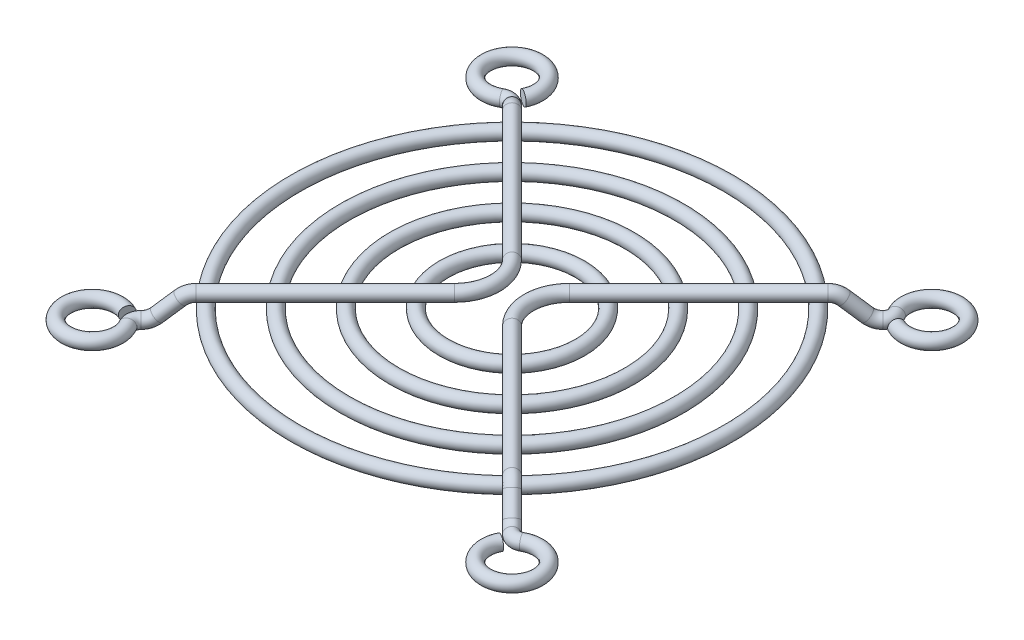
ISO-10303-21;
HEADER;
FILE_DESCRIPTION(('STEP AP214'),'2;1');
FILE_NAME('part.step','',(''),(''),'','','');
FILE_SCHEMA(('AUTOMOTIVE_DESIGN { 1 0 10303 214 1 1 1 1 }'));
ENDSEC;
DATA;
#1=APPLICATION_CONTEXT('core data for automotive mechanical design processes');
#2=APPLICATION_PROTOCOL_DEFINITION('international standard','automotive_design',2000,#1);
#3=PRODUCT_CONTEXT('',#1,'mechanical');
#4=PRODUCT('Part','Part','',(#3));
#5=PRODUCT_RELATED_PRODUCT_CATEGORY('part','',(#4));
#6=PRODUCT_DEFINITION_FORMATION('','',#4);
#7=PRODUCT_DEFINITION_CONTEXT('part definition',#1,'design');
#8=PRODUCT_DEFINITION('design','',#6,#7);
#9=PRODUCT_DEFINITION_SHAPE('','',#8);
#10=(LENGTH_UNIT() NAMED_UNIT(*) SI_UNIT(.MILLI.,.METRE.));
#11=(NAMED_UNIT(*) PLANE_ANGLE_UNIT() SI_UNIT($,.RADIAN.));
#12=(NAMED_UNIT(*) SI_UNIT($,.STERADIAN.) SOLID_ANGLE_UNIT());
#13=UNCERTAINTY_MEASURE_WITH_UNIT(LENGTH_MEASURE(1.E-05),#10,'distance_accuracy_value','');
#14=(GEOMETRIC_REPRESENTATION_CONTEXT(3) GLOBAL_UNCERTAINTY_ASSIGNED_CONTEXT((#13)) GLOBAL_UNIT_ASSIGNED_CONTEXT((#10,
#11,#12)) REPRESENTATION_CONTEXT('',''));
#15=CARTESIAN_POINT('',(0.,0.,0.));
#16=DIRECTION('',(0.,0.,1.));
#17=DIRECTION('',(1.,0.,0.));
#18=AXIS2_PLACEMENT_3D('',#15,#16,#17);
#19=CARTESIAN_POINT('',(3.41421356237311,3.6,3.41421356237314));
#20=DIRECTION('',(0.707106781186544,0.,0.707106781186551));
#21=DIRECTION('',(0.707106781186551,0.,-0.707106781186544));
#22=AXIS2_PLACEMENT_3D('',#19,#20,#21);
#23=CYLINDRICAL_SURFACE('',#22,0.799999999999999);
#24=CARTESIAN_POINT('',(3.41421356237311,3.6,3.41421356237314));
#25=DIRECTION('',(-0.707106781186545,0.,-0.707106781186551));
#26=DIRECTION('',(-0.707106781186551,0.,0.707106781186545));
#27=AXIS2_PLACEMENT_3D('',#24,#25,#26);
#28=CIRCLE('',#27,0.799999999999999);
#29=CARTESIAN_POINT('',(2.84852813742387,3.6,3.97989898732237));
#30=VERTEX_POINT('',#29);
#31=EDGE_CURVE('E11',#30,#30,#28,.T.);
#32=ORIENTED_EDGE('',*,*,#31,.F.);
#33=EDGE_LOOP('',(#32));
#34=FACE_BOUND('',#33,.T.);
#35=CARTESIAN_POINT('',(18.8161114473739,3.6,18.8161114473741));
#36=DIRECTION('',(0.707106781186543,0.,0.707106781186552));
#37=DIRECTION('',(0.707106781186552,0.,-0.707106781186543));
#38=AXIS2_PLACEMENT_3D('',#35,#36,#37);
#39=CIRCLE('',#38,0.799999999999998);
#40=CARTESIAN_POINT('',(18.8161114473739,4.4,18.8161114473741));
#41=VERTEX_POINT('',#40);
#42=EDGE_CURVE('E63',#41,#41,#39,.T.);
#43=ORIENTED_EDGE('',*,*,#42,.F.);
#44=EDGE_LOOP('',(#43));
#45=FACE_BOUND('',#44,.T.);
#46=ADVANCED_FACE('F44',(#34,#45),#23,.T.);
#47=CARTESIAN_POINT('',(22.1008621971351,2.8,22.1008621971353));
#48=DIRECTION('',(-0.707106781186546,0.,0.707106781186549));
#49=DIRECTION('',(0.707106781186549,0.,0.707106781186546));
#50=AXIS2_PLACEMENT_3D('',#47,#48,#49);
#51=TOROIDAL_SURFACE('',#50,2.,0.799999999999998);
#52=CARTESIAN_POINT('',(21.1546131813162,1.3136536069531,21.1546131813164));
#53=DIRECTION('',(0.525502806857811,-0.669099095776639,0.52550280685782));
#54=DIRECTION('',(0.70710678118655,0.,-0.707106781186545));
#55=AXIS2_PLACEMENT_3D('',#52,#53,#54);
#56=CIRCLE('',#55,0.799999999999998);
#57=CARTESIAN_POINT('',(20.7761135749886,0.719115049734336,20.7761135749888));
#58=VERTEX_POINT('',#57);
#59=EDGE_CURVE('E54',#58,#58,#56,.T.);
#60=CARTESIAN_POINT('',(22.1008621971351,0.800000000000002,22.1008621971353));
#61=DIRECTION('',(0.707106781186543,0.,0.707106781186551));
#62=DIRECTION('',(0.707106781186552,0.,-0.707106781186544));
#63=AXIS2_PLACEMENT_3D('',#60,#61,#62);
#64=CIRCLE('',#63,0.799999999999998);
#65=CARTESIAN_POINT('',(22.1008621971351,0.,22.1008621971353));
#66=VERTEX_POINT('',#65);
#67=EDGE_CURVE('E50',#66,#66,#64,.T.);
#68=CARTESIAN_POINT('',(22.1008621971351,2.8,22.1008621971353));
#69=DIRECTION('',(-0.707106781186546,0.,0.707106781186549));
#70=DIRECTION('',(0.707106781186549,0.,0.707106781186546));
#71=AXIS2_PLACEMENT_3D('',#68,#69,#70);
#72=CIRCLE('',#71,2.79999999999999);
#73=EDGE_CURVE('',#58,#66,#72,.T.);
#74=ORIENTED_EDGE('',*,*,#59,.T.);
#75=ORIENTED_EDGE('',*,*,#67,.F.);
#76=ORIENTED_EDGE('',*,*,#73,.T.);
#77=ORIENTED_EDGE('',*,*,#73,.F.);
#78=EDGE_LOOP('',(#74,#76,#75,#77));
#79=FACE_BOUND('',#78,.T.);
#80=ADVANCED_FACE('F121',(#79),#51,.T.);
#81=CARTESIAN_POINT('',(19.7623604631928,3.0863463930469,19.762360463193));
#82=DIRECTION('',(0.525502806857816,-0.669099095776639,0.525502806857815));
#83=DIRECTION('',(-0.786442750779605,-0.617663176615062,0.));
#84=AXIS2_PLACEMENT_3D('',#81,#82,#83);
#85=CYLINDRICAL_SURFACE('',#84,0.799999999999998);
#86=CARTESIAN_POINT('',(19.7623604631928,3.0863463930469,19.762360463193));
#87=DIRECTION('',(0.525502806857811,-0.669099095776639,0.52550280685782));
#88=DIRECTION('',(0.70710678118655,0.,-0.707106781186545));
#89=AXIS2_PLACEMENT_3D('',#86,#87,#88);
#90=CIRCLE('',#89,0.799999999999998);
#91=CARTESIAN_POINT('',(20.1408600695204,3.68088495026566,20.1408600695206));
#92=VERTEX_POINT('',#91);
#93=EDGE_CURVE('E58',#92,#92,#90,.T.);
#94=ORIENTED_EDGE('',*,*,#93,.T.);
#95=EDGE_LOOP('',(#94));
#96=FACE_BOUND('',#95,.T.);
#97=ORIENTED_EDGE('',*,*,#59,.F.);
#98=EDGE_LOOP('',(#97));
#99=FACE_BOUND('',#98,.T.);
#100=ADVANCED_FACE('F126',(#96,#99),#85,.T.);
#101=CARTESIAN_POINT('',(18.8161114473739,1.6,18.8161114473741));
#102=DIRECTION('',(-0.707106781186546,0.,0.707106781186549));
#103=DIRECTION('',(0.707106781186549,0.,0.707106781186546));
#104=AXIS2_PLACEMENT_3D('',#101,#102,#103);
#105=TOROIDAL_SURFACE('',#104,2.,0.799999999999998);
#106=CARTESIAN_POINT('',(18.8161114473739,1.6,18.8161114473741));
#107=DIRECTION('',(-0.707106781186546,0.,0.707106781186549));
#108=DIRECTION('',(0.707106781186549,0.,0.707106781186546));
#109=AXIS2_PLACEMENT_3D('',#106,#107,#108);
#110=CIRCLE('',#109,2.8);
#111=EDGE_CURVE('',#92,#41,#110,.T.);
#112=ORIENTED_EDGE('',*,*,#93,.F.);
#113=ORIENTED_EDGE('',*,*,#42,.T.);
#114=ORIENTED_EDGE('',*,*,#111,.T.);
#115=ORIENTED_EDGE('',*,*,#111,.F.);
#116=EDGE_LOOP('',(#112,#114,#113,#115));
#117=FACE_BOUND('',#116,.T.);
#118=ADVANCED_FACE('F131',(#117),#105,.T.);
#119=CARTESIAN_POINT('',(24.9999999999999,0.800000000000002,25.0000000000001));
#120=DIRECTION('',(0.,-1.,0.));
#121=DIRECTION('',(0.,0.,1.));
#122=AXIS2_PLACEMENT_3D('',#119,#120,#121);
#123=TOROIDAL_SURFACE('',#122,3.09999999999999,0.800000000000002);
#124=CARTESIAN_POINT('',(23.488311687548,0.800000000000002,22.2935635152482));
#125=DIRECTION('',(0.873044027339341,0.,-0.487641391113495));
#126=DIRECTION('',(-0.487641391113495,0.,-0.873044027339341));
#127=AXIS2_PLACEMENT_3D('',#124,#125,#126);
#128=CIRCLE('',#127,0.800000000000002);
#129=CARTESIAN_POINT('',(23.0981985746572,0.800000000000002,21.5951282933767));
#130=VERTEX_POINT('',#129);
#131=EDGE_CURVE('E69',#130,#130,#128,.T.);
#132=CARTESIAN_POINT('',(22.2417768209678,0.800000000000002,23.5850071043818));
#133=DIRECTION('',(0.45644932116719,0.,-0.88974941259099));
#134=DIRECTION('',(-0.88974941259099,0.,-0.45644932116719));
#135=AXIS2_PLACEMENT_3D('',#132,#133,#134);
#136=CIRCLE('',#135,0.800000000000002);
#137=CARTESIAN_POINT('',(21.529977290895,0.800000000000002,23.2198476474481));
#138=VERTEX_POINT('',#137);
#139=EDGE_CURVE('E66',#138,#138,#136,.T.);
#140=CARTESIAN_POINT('',(24.9999999999999,0.800000000000002,25.0000000000001));
#141=DIRECTION('',(0.,-1.,0.));
#142=DIRECTION('',(0.,0.,1.));
#143=AXIS2_PLACEMENT_3D('',#140,#141,#142);
#144=CIRCLE('',#143,3.89999999999999);
#145=EDGE_CURVE('',#130,#138,#144,.T.);
#146=ORIENTED_EDGE('',*,*,#131,.T.);
#147=ORIENTED_EDGE('',*,*,#139,.F.);
#148=ORIENTED_EDGE('',*,*,#145,.T.);
#149=ORIENTED_EDGE('',*,*,#145,.F.);
#150=EDGE_LOOP('',(#146,#148,#147,#149));
#151=FACE_BOUND('',#150,.T.);
#152=ADVANCED_FACE('F133',(#151),#123,.T.);
#153=CARTESIAN_POINT('',(22.9220184591582,0.800000000000002,21.2797059351122));
#154=DIRECTION('',(0.,-1.,0.));
#155=DIRECTION('',(0.,0.,1.));
#156=AXIS2_PLACEMENT_3D('',#153,#154,#155);
#157=TOROIDAL_SURFACE('',#156,1.16129032258065,0.800000000000002);
#158=ORIENTED_EDGE('',*,*,#131,.F.);
#159=EDGE_LOOP('',(#158));
#160=FACE_BOUND('',#159,.T.);
#161=ORIENTED_EDGE('',*,*,#67,.T.);
#162=EDGE_LOOP('',(#161));
#163=FACE_BOUND('',#162,.T.);
#164=ADVANCED_FACE('F140',(#160,#163),#157,.T.);
#165=CARTESIAN_POINT('',(22.2417768209678,0.800000000000002,23.5850071043818));
#166=DIRECTION('',(0.45644932116719,0.,-0.88974941259099));
#167=DIRECTION('',(-0.88974941259099,0.,-0.45644932116719));
#168=AXIS2_PLACEMENT_3D('',#165,#166,#167);
#169=PLANE('',#168);
#170=ORIENTED_EDGE('',*,*,#139,.T.);
#171=EDGE_LOOP('',(#170));
#172=FACE_BOUND('',#171,.T.);
#173=ADVANCED_FACE('F143',(#172),#169,.T.);
#174=CARTESIAN_POINT('',(6.82842712474629,3.6,0.));
#175=DIRECTION('',(0.,-1.,0.));
#176=DIRECTION('',(0.,0.,-1.));
#177=AXIS2_PLACEMENT_3D('',#174,#175,#176);
#178=TOROIDAL_SURFACE('',#177,4.82842712474628,0.8);
#179=CARTESIAN_POINT('',(3.41421356237311,3.6,-3.41421356237314));
#180=DIRECTION('',(-0.707106781186543,0.,0.707106781186552));
#181=DIRECTION('',(0.707106781186552,0.,0.707106781186543));
#182=AXIS2_PLACEMENT_3D('',#179,#180,#181);
#183=CIRCLE('',#182,0.799999999999999);
#184=CARTESIAN_POINT('',(2.84852813742386,3.6,-3.97989898732238));
#185=VERTEX_POINT('',#184);
#186=EDGE_CURVE('E72',#185,#185,#183,.T.);
#187=CARTESIAN_POINT('',(6.82842712474629,3.6,0.));
#188=DIRECTION('',(0.,-1.,0.));
#189=DIRECTION('',(0.,0.,-1.));
#190=AXIS2_PLACEMENT_3D('',#187,#188,#189);
#191=CIRCLE('',#190,5.62842712474628);
#192=EDGE_CURVE('',#30,#185,#191,.T.);
#193=ORIENTED_EDGE('',*,*,#31,.T.);
#194=ORIENTED_EDGE('',*,*,#186,.T.);
#195=ORIENTED_EDGE('',*,*,#192,.T.);
#196=ORIENTED_EDGE('',*,*,#192,.F.);
#197=EDGE_LOOP('',(#193,#195,#194,#196));
#198=FACE_BOUND('',#197,.T.);
#199=ADVANCED_FACE('F117',(#198),#178,.T.);
#200=CARTESIAN_POINT('',(3.41421356237311,3.6,-3.41421356237314));
#201=DIRECTION('',(0.707106781186544,0.,-0.707106781186551));
#202=DIRECTION('',(-0.707106781186551,0.,-0.707106781186544));
#203=AXIS2_PLACEMENT_3D('',#200,#201,#202);
#204=CYLINDRICAL_SURFACE('',#203,0.799999999999999);
#205=ORIENTED_EDGE('',*,*,#186,.F.);
#206=EDGE_LOOP('',(#205));
#207=FACE_BOUND('',#206,.T.);
#208=CARTESIAN_POINT('',(18.8161114473739,3.6,-18.8161114473741));
#209=DIRECTION('',(0.707106781186544,0.,-0.707106781186551));
#210=DIRECTION('',(-0.707106781186551,0.,-0.707106781186544));
#211=AXIS2_PLACEMENT_3D('',#208,#209,#210);
#212=CIRCLE('',#211,0.799999999999998);
#213=CARTESIAN_POINT('',(18.8161114473739,4.4,-18.8161114473741));
#214=VERTEX_POINT('',#213);
#215=EDGE_CURVE('E84',#214,#214,#212,.T.);
#216=ORIENTED_EDGE('',*,*,#215,.F.);
#217=EDGE_LOOP('',(#216));
#218=FACE_BOUND('',#217,.T.);
#219=ADVANCED_FACE('F107',(#207,#218),#204,.T.);
#220=CARTESIAN_POINT('',(22.100862197135,2.8,-22.1008621971353));
#221=DIRECTION('',(0.707106781186556,0.,0.707106781186539));
#222=DIRECTION('',(0.707106781186539,0.,-0.707106781186556));
#223=AXIS2_PLACEMENT_3D('',#220,#221,#222);
#224=TOROIDAL_SURFACE('',#223,2.,0.799999999999998);
#225=CARTESIAN_POINT('',(21.1546131813162,1.3136536069531,-21.1546131813164));
#226=DIRECTION('',(0.525502806857814,-0.669099095776639,-0.525502806857817));
#227=DIRECTION('',(-0.707106781186552,0.,-0.707106781186543));
#228=AXIS2_PLACEMENT_3D('',#225,#226,#227);
#229=CIRCLE('',#228,0.799999999999998);
#230=CARTESIAN_POINT('',(20.7761135749886,0.719115049734336,-20.7761135749888));
#231=VERTEX_POINT('',#230);
#232=EDGE_CURVE('E78',#231,#231,#229,.T.);
#233=CARTESIAN_POINT('',(22.100862197135,0.800000000000002,-22.1008621971353));
#234=DIRECTION('',(0.707106781186544,0.,-0.707106781186551));
#235=DIRECTION('',(-0.707106781186551,0.,-0.707106781186544));
#236=AXIS2_PLACEMENT_3D('',#233,#234,#235);
#237=CIRCLE('',#236,0.799999999999998);
#238=CARTESIAN_POINT('',(22.100862197135,0.,-22.1008621971353));
#239=VERTEX_POINT('',#238);
#240=EDGE_CURVE('E75',#239,#239,#237,.T.);
#241=CARTESIAN_POINT('',(22.100862197135,2.8,-22.1008621971353));
#242=DIRECTION('',(0.707106781186556,0.,0.707106781186539));
#243=DIRECTION('',(0.707106781186539,0.,-0.707106781186556));
#244=AXIS2_PLACEMENT_3D('',#241,#242,#243);
#245=CIRCLE('',#244,2.79999999999999);
#246=EDGE_CURVE('',#231,#239,#245,.T.);
#247=ORIENTED_EDGE('',*,*,#232,.T.);
#248=ORIENTED_EDGE('',*,*,#240,.F.);
#249=ORIENTED_EDGE('',*,*,#246,.T.);
#250=ORIENTED_EDGE('',*,*,#246,.F.);
#251=EDGE_LOOP('',(#247,#249,#248,#250));
#252=FACE_BOUND('',#251,.T.);
#253=ADVANCED_FACE('F104',(#252),#224,.T.);
#254=CARTESIAN_POINT('',(19.7623604631928,3.0863463930469,-19.762360463193));
#255=DIRECTION('',(0.525502806857809,-0.669099095776639,-0.525502806857822));
#256=DIRECTION('',(0.,-0.617663176615062,0.786442750779605));
#257=AXIS2_PLACEMENT_3D('',#254,#255,#256);
#258=CYLINDRICAL_SURFACE('',#257,0.799999999999998);
#259=CARTESIAN_POINT('',(19.7623604631928,3.0863463930469,-19.762360463193));
#260=DIRECTION('',(0.525502806857814,-0.669099095776639,-0.525502806857817));
#261=DIRECTION('',(-0.707106781186552,0.,-0.707106781186543));
#262=AXIS2_PLACEMENT_3D('',#259,#260,#261);
#263=CIRCLE('',#262,0.799999999999998);
#264=CARTESIAN_POINT('',(20.1408600695204,3.68088495026566,-20.1408600695206));
#265=VERTEX_POINT('',#264);
#266=EDGE_CURVE('E81',#265,#265,#263,.T.);
#267=ORIENTED_EDGE('',*,*,#266,.T.);
#268=EDGE_LOOP('',(#267));
#269=FACE_BOUND('',#268,.T.);
#270=ORIENTED_EDGE('',*,*,#232,.F.);
#271=EDGE_LOOP('',(#270));
#272=FACE_BOUND('',#271,.T.);
#273=ADVANCED_FACE('F106',(#269,#272),#258,.T.);
#274=CARTESIAN_POINT('',(18.8161114473739,1.6,-18.8161114473741));
#275=DIRECTION('',(0.707106781186556,0.,0.707106781186539));
#276=DIRECTION('',(0.707106781186539,0.,-0.707106781186556));
#277=AXIS2_PLACEMENT_3D('',#274,#275,#276);
#278=TOROIDAL_SURFACE('',#277,2.,0.799999999999998);
#279=CARTESIAN_POINT('',(18.8161114473739,1.6,-18.8161114473741));
#280=DIRECTION('',(0.707106781186556,0.,0.707106781186539));
#281=DIRECTION('',(0.707106781186539,0.,-0.707106781186556));
#282=AXIS2_PLACEMENT_3D('',#279,#280,#281);
#283=CIRCLE('',#282,2.8);
#284=EDGE_CURVE('',#265,#214,#283,.T.);
#285=ORIENTED_EDGE('',*,*,#266,.F.);
#286=ORIENTED_EDGE('',*,*,#215,.T.);
#287=ORIENTED_EDGE('',*,*,#284,.T.);
#288=ORIENTED_EDGE('',*,*,#284,.F.);
#289=EDGE_LOOP('',(#285,#287,#286,#288));
#290=FACE_BOUND('',#289,.T.);
#291=ADVANCED_FACE('F114',(#290),#278,.T.);
#292=CARTESIAN_POINT('',(24.9999999999999,0.800000000000002,-25.0000000000001));
#293=DIRECTION('',(0.,-1.,0.));
#294=DIRECTION('',(1.,0.,0.));
#295=AXIS2_PLACEMENT_3D('',#292,#293,#294);
#296=TOROIDAL_SURFACE('',#295,3.09999999999999,0.800000000000002);
#297=CARTESIAN_POINT('',(22.2935635152479,0.800000000000002,-23.4883116875483));
#298=DIRECTION('',(-0.487641391113505,0.,-0.873044027339335));
#299=DIRECTION('',(-0.873044027339335,0.,0.487641391113505));
#300=AXIS2_PLACEMENT_3D('',#297,#298,#299);
#301=CIRCLE('',#300,0.800000000000002);
#302=CARTESIAN_POINT('',(21.5951282933765,0.800000000000002,-23.0981985746575));
#303=VERTEX_POINT('',#302);
#304=EDGE_CURVE('E90',#303,#303,#301,.T.);
#305=CARTESIAN_POINT('',(23.5850071043816,0.800000000000002,-22.2417768209681));
#306=DIRECTION('',(-0.889749412590994,0.,-0.456449321167181));
#307=DIRECTION('',(-0.456449321167181,0.,0.889749412590994));
#308=AXIS2_PLACEMENT_3D('',#305,#306,#307);
#309=CIRCLE('',#308,0.800000000000002);
#310=CARTESIAN_POINT('',(23.2198476474479,0.800000000000002,-21.5299772908953));
#311=VERTEX_POINT('',#310);
#312=EDGE_CURVE('E87',#311,#311,#309,.T.);
#313=CARTESIAN_POINT('',(24.9999999999999,0.800000000000002,-25.0000000000001));
#314=DIRECTION('',(0.,-1.,0.));
#315=DIRECTION('',(1.,0.,0.));
#316=AXIS2_PLACEMENT_3D('',#313,#314,#315);
#317=CIRCLE('',#316,3.89999999999999);
#318=EDGE_CURVE('',#303,#311,#317,.T.);
#319=ORIENTED_EDGE('',*,*,#304,.T.);
#320=ORIENTED_EDGE('',*,*,#312,.F.);
#321=ORIENTED_EDGE('',*,*,#318,.T.);
#322=ORIENTED_EDGE('',*,*,#318,.F.);
#323=EDGE_LOOP('',(#319,#321,#320,#322));
#324=FACE_BOUND('',#323,.T.);
#325=ADVANCED_FACE('F94',(#324),#296,.T.);
#326=CARTESIAN_POINT('',(21.2797059351119,0.800000000000002,-22.9220184591584));
#327=DIRECTION('',(0.,-1.,0.));
#328=DIRECTION('',(1.,0.,0.));
#329=AXIS2_PLACEMENT_3D('',#326,#327,#328);
#330=TOROIDAL_SURFACE('',#329,1.16129032258065,0.800000000000002);
#331=ORIENTED_EDGE('',*,*,#304,.F.);
#332=EDGE_LOOP('',(#331));
#333=FACE_BOUND('',#332,.T.);
#334=ORIENTED_EDGE('',*,*,#240,.T.);
#335=EDGE_LOOP('',(#334));
#336=FACE_BOUND('',#335,.T.);
#337=ADVANCED_FACE('F97',(#333,#336),#330,.T.);
#338=CARTESIAN_POINT('',(23.5850071043816,0.800000000000002,-22.2417768209681));
#339=DIRECTION('',(-0.889749412590994,0.,-0.456449321167181));
#340=DIRECTION('',(-0.456449321167181,0.,0.889749412590994));
#341=AXIS2_PLACEMENT_3D('',#338,#339,#340);
#342=PLANE('',#341);
#343=ORIENTED_EDGE('',*,*,#312,.T.);
#344=EDGE_LOOP('',(#343));
#345=FACE_BOUND('',#344,.T.);
#346=ADVANCED_FACE('F100',(#345),#342,.T.);
#347=CLOSED_SHELL('',(#46,#80,#100,#118,#152,#164,#173,#199,#219,#253,#273,#291,#325,#337,#346));
#348=MANIFOLD_SOLID_BREP('B2',#347);
#349=CARTESIAN_POINT('',(-3.41421356237313,3.6,3.41421356237312));
#350=DIRECTION('',(-0.707106781186549,0.,0.707106781186546));
#351=DIRECTION('',(0.707106781186546,0.,0.707106781186549));
#352=AXIS2_PLACEMENT_3D('',#349,#350,#351);
#353=CYLINDRICAL_SURFACE('',#352,0.799999999999999);
#354=CARTESIAN_POINT('',(-3.41421356237313,3.6,3.41421356237312));
#355=DIRECTION('',(0.707106781186548,0.,-0.707106781186547));
#356=DIRECTION('',(-0.707106781186547,0.,-0.707106781186548));
#357=AXIS2_PLACEMENT_3D('',#354,#355,#356);
#358=CIRCLE('',#357,0.799999999999999);
#359=CARTESIAN_POINT('',(-2.84852813742389,3.6,3.97989898732236));
#360=VERTEX_POINT('',#359);
#361=EDGE_CURVE('E43',#360,#360,#358,.T.);
#362=ORIENTED_EDGE('',*,*,#361,.F.);
#363=EDGE_LOOP('',(#362));
#364=FACE_BOUND('',#363,.T.);
#365=CARTESIAN_POINT('',(-18.8161114473741,3.6,18.816111447374));
#366=DIRECTION('',(-0.707106781186549,0.,0.707106781186546));
#367=DIRECTION('',(0.707106781186546,0.,0.707106781186549));
#368=AXIS2_PLACEMENT_3D('',#365,#366,#367);
#369=CIRCLE('',#368,0.799999999999998);
#370=CARTESIAN_POINT('',(-18.8161114473741,4.4,18.816111447374));
#371=VERTEX_POINT('',#370);
#372=EDGE_CURVE('E290',#371,#371,#369,.T.);
#373=ORIENTED_EDGE('',*,*,#372,.F.);
#374=EDGE_LOOP('',(#373));
#375=FACE_BOUND('',#374,.T.);
#376=ADVANCED_FACE('F271',(#364,#375),#353,.T.);
#377=CARTESIAN_POINT('',(-22.1008621971352,2.8,22.1008621971351));
#378=DIRECTION('',(-0.707106781186551,0.,-0.707106781186544));
#379=DIRECTION('',(-0.707106781186544,0.,0.707106781186551));
#380=AXIS2_PLACEMENT_3D('',#377,#378,#379);
#381=TOROIDAL_SURFACE('',#380,2.,0.799999999999998);
#382=CARTESIAN_POINT('',(-21.1546131813163,1.3136536069531,21.1546131813163));
#383=DIRECTION('',(-0.525502806857818,-0.669099095776639,0.525502806857813));
#384=DIRECTION('',(0.707106781186547,0.,0.707106781186548));
#385=AXIS2_PLACEMENT_3D('',#382,#383,#384);
#386=CIRCLE('',#385,0.799999999999998);
#387=CARTESIAN_POINT('',(-20.7761135749887,0.719115049734336,20.7761135749887));
#388=VERTEX_POINT('',#387);
#389=EDGE_CURVE('E281',#388,#388,#386,.T.);
#390=CARTESIAN_POINT('',(-22.1008621971352,0.800000000000002,22.1008621971352));
#391=DIRECTION('',(-0.707106781186549,0.,0.707106781186546));
#392=DIRECTION('',(0.707106781186546,0.,0.707106781186549));
#393=AXIS2_PLACEMENT_3D('',#390,#391,#392);
#394=CIRCLE('',#393,0.799999999999998);
#395=CARTESIAN_POINT('',(-22.1008621971352,0.,22.1008621971352));
#396=VERTEX_POINT('',#395);
#397=EDGE_CURVE('E277',#396,#396,#394,.T.);
#398=CARTESIAN_POINT('',(-22.1008621971352,2.8,22.1008621971351));
#399=DIRECTION('',(-0.707106781186551,0.,-0.707106781186544));
#400=DIRECTION('',(-0.707106781186544,0.,0.707106781186551));
#401=AXIS2_PLACEMENT_3D('',#398,#399,#400);
#402=CIRCLE('',#401,2.79999999999999);
#403=EDGE_CURVE('',#388,#396,#402,.T.);
#404=ORIENTED_EDGE('',*,*,#389,.T.);
#405=ORIENTED_EDGE('',*,*,#397,.F.);
#406=ORIENTED_EDGE('',*,*,#403,.T.);
#407=ORIENTED_EDGE('',*,*,#403,.F.);
#408=EDGE_LOOP('',(#404,#406,#405,#407));
#409=FACE_BOUND('',#408,.T.);
#410=ADVANCED_FACE('F348',(#409),#381,.T.);
#411=CARTESIAN_POINT('',(-19.762360463193,3.0863463930469,19.7623604631929));
#412=DIRECTION('',(-0.525502806857813,-0.669099095776639,0.525502806857818));
#413=DIRECTION('',(0.,-0.617663176615062,-0.786442750779605));
#414=AXIS2_PLACEMENT_3D('',#411,#412,#413);
#415=CYLINDRICAL_SURFACE('',#414,0.799999999999998);
#416=CARTESIAN_POINT('',(-19.762360463193,3.0863463930469,19.7623604631929));
#417=DIRECTION('',(-0.525502806857818,-0.669099095776639,0.525502806857813));
#418=DIRECTION('',(0.707106781186547,0.,0.707106781186548));
#419=AXIS2_PLACEMENT_3D('',#416,#417,#418);
#420=CIRCLE('',#419,0.799999999999998);
#421=CARTESIAN_POINT('',(-20.1408600695205,3.68088495026566,20.1408600695205));
#422=VERTEX_POINT('',#421);
#423=EDGE_CURVE('E285',#422,#422,#420,.T.);
#424=ORIENTED_EDGE('',*,*,#423,.T.);
#425=EDGE_LOOP('',(#424));
#426=FACE_BOUND('',#425,.T.);
#427=ORIENTED_EDGE('',*,*,#389,.F.);
#428=EDGE_LOOP('',(#427));
#429=FACE_BOUND('',#428,.T.);
#430=ADVANCED_FACE('F353',(#426,#429),#415,.T.);
#431=CARTESIAN_POINT('',(-18.8161114473741,1.6,18.816111447374));
#432=DIRECTION('',(-0.707106781186551,0.,-0.707106781186544));
#433=DIRECTION('',(-0.707106781186544,0.,0.707106781186551));
#434=AXIS2_PLACEMENT_3D('',#431,#432,#433);
#435=TOROIDAL_SURFACE('',#434,2.,0.799999999999998);
#436=CARTESIAN_POINT('',(-18.8161114473741,1.6,18.816111447374));
#437=DIRECTION('',(-0.707106781186551,0.,-0.707106781186544));
#438=DIRECTION('',(-0.707106781186544,0.,0.707106781186551));
#439=AXIS2_PLACEMENT_3D('',#436,#437,#438);
#440=CIRCLE('',#439,2.8);
#441=EDGE_CURVE('',#422,#371,#440,.T.);
#442=ORIENTED_EDGE('',*,*,#423,.F.);
#443=ORIENTED_EDGE('',*,*,#372,.T.);
#444=ORIENTED_EDGE('',*,*,#441,.T.);
#445=ORIENTED_EDGE('',*,*,#441,.F.);
#446=EDGE_LOOP('',(#442,#444,#443,#445));
#447=FACE_BOUND('',#446,.T.);
#448=ADVANCED_FACE('F358',(#447),#435,.T.);
#449=CARTESIAN_POINT('',(-25.0000000000001,0.800000000000002,25.));
#450=DIRECTION('',(0.,-1.,0.));
#451=DIRECTION('',(-1.,0.,0.));
#452=AXIS2_PLACEMENT_3D('',#449,#450,#451);
#453=TOROIDAL_SURFACE('',#452,3.09999999999999,0.800000000000002);
#454=CARTESIAN_POINT('',(-22.2935635152481,0.800000000000002,23.4883116875481));
#455=DIRECTION('',(0.487641391113498,0.,0.873044027339339));
#456=DIRECTION('',(0.873044027339339,0.,-0.487641391113498));
#457=AXIS2_PLACEMENT_3D('',#454,#455,#456);
#458=CIRCLE('',#457,0.800000000000002);
#459=CARTESIAN_POINT('',(-21.5951282933766,0.800000000000002,23.0981985746573));
#460=VERTEX_POINT('',#459);
#461=EDGE_CURVE('E296',#460,#460,#458,.T.);
#462=CARTESIAN_POINT('',(-23.5850071043818,0.800000000000002,22.2417768209679));
#463=DIRECTION('',(0.889749412590991,0.,0.456449321167187));
#464=DIRECTION('',(0.456449321167187,0.,-0.889749412590991));
#465=AXIS2_PLACEMENT_3D('',#462,#463,#464);
#466=CIRCLE('',#465,0.800000000000002);
#467=CARTESIAN_POINT('',(-23.219847647448,0.800000000000002,21.5299772908951));
#468=VERTEX_POINT('',#467);
#469=EDGE_CURVE('E293',#468,#468,#466,.T.);
#470=CARTESIAN_POINT('',(-25.0000000000001,0.800000000000002,25.));
#471=DIRECTION('',(0.,-1.,0.));
#472=DIRECTION('',(-1.,0.,0.));
#473=AXIS2_PLACEMENT_3D('',#470,#471,#472);
#474=CIRCLE('',#473,3.89999999999999);
#475=EDGE_CURVE('',#460,#468,#474,.T.);
#476=ORIENTED_EDGE('',*,*,#461,.T.);
#477=ORIENTED_EDGE('',*,*,#469,.F.);
#478=ORIENTED_EDGE('',*,*,#475,.T.);
#479=ORIENTED_EDGE('',*,*,#475,.F.);
#480=EDGE_LOOP('',(#476,#478,#477,#479));
#481=FACE_BOUND('',#480,.T.);
#482=ADVANCED_FACE('F360',(#481),#453,.T.);
#483=CARTESIAN_POINT('',(-21.2797059351121,0.800000000000002,22.9220184591582));
#484=DIRECTION('',(0.,-1.,0.));
#485=DIRECTION('',(-1.,0.,0.));
#486=AXIS2_PLACEMENT_3D('',#483,#484,#485);
#487=TOROIDAL_SURFACE('',#486,1.16129032258065,0.800000000000002);
#488=ORIENTED_EDGE('',*,*,#461,.F.);
#489=EDGE_LOOP('',(#488));
#490=FACE_BOUND('',#489,.T.);
#491=ORIENTED_EDGE('',*,*,#397,.T.);
#492=EDGE_LOOP('',(#491));
#493=FACE_BOUND('',#492,.T.);
#494=ADVANCED_FACE('F367',(#490,#493),#487,.T.);
#495=CARTESIAN_POINT('',(-23.5850071043818,0.800000000000002,22.2417768209679));
#496=DIRECTION('',(0.889749412590991,0.,0.456449321167187));
#497=DIRECTION('',(0.456449321167187,0.,-0.889749412590991));
#498=AXIS2_PLACEMENT_3D('',#495,#496,#497);
#499=PLANE('',#498);
#500=ORIENTED_EDGE('',*,*,#469,.T.);
#501=EDGE_LOOP('',(#500));
#502=FACE_BOUND('',#501,.T.);
#503=ADVANCED_FACE('F370',(#502),#499,.T.);
#504=CARTESIAN_POINT('',(-6.82842712474626,3.6,0.));
#505=DIRECTION('',(0.,1.,0.));
#506=DIRECTION('',(0.,0.,1.));
#507=AXIS2_PLACEMENT_3D('',#504,#505,#506);
#508=TOROIDAL_SURFACE('',#507,4.82842712474625,0.799999999999999);
#509=CARTESIAN_POINT('',(-3.41421356237311,3.6,-3.41421356237314));
#510=DIRECTION('',(0.707106781186545,0.,0.707106781186551));
#511=DIRECTION('',(0.707106781186551,0.,-0.707106781186545));
#512=AXIS2_PLACEMENT_3D('',#509,#510,#511);
#513=CIRCLE('',#512,0.799999999999999);
#514=CARTESIAN_POINT('',(-2.84852813742387,3.6,-3.97989898732238));
#515=VERTEX_POINT('',#514);
#516=EDGE_CURVE('E299',#515,#515,#513,.T.);
#517=CARTESIAN_POINT('',(-6.82842712474626,3.6,0.));
#518=DIRECTION('',(0.,1.,0.));
#519=DIRECTION('',(0.,0.,1.));
#520=AXIS2_PLACEMENT_3D('',#517,#518,#519);
#521=CIRCLE('',#520,5.62842712474625);
#522=EDGE_CURVE('',#360,#515,#521,.T.);
#523=ORIENTED_EDGE('',*,*,#361,.T.);
#524=ORIENTED_EDGE('',*,*,#516,.T.);
#525=ORIENTED_EDGE('',*,*,#522,.T.);
#526=ORIENTED_EDGE('',*,*,#522,.F.);
#527=EDGE_LOOP('',(#523,#525,#524,#526));
#528=FACE_BOUND('',#527,.T.);
#529=ADVANCED_FACE('F344',(#528),#508,.T.);
#530=CARTESIAN_POINT('',(-3.41421356237311,3.6,-3.41421356237314));
#531=DIRECTION('',(-0.707106781186544,0.,-0.707106781186551));
#532=DIRECTION('',(-0.707106781186551,0.,0.707106781186544));
#533=AXIS2_PLACEMENT_3D('',#530,#531,#532);
#534=CYLINDRICAL_SURFACE('',#533,0.799999999999999);
#535=ORIENTED_EDGE('',*,*,#516,.F.);
#536=EDGE_LOOP('',(#535));
#537=FACE_BOUND('',#536,.T.);
#538=CARTESIAN_POINT('',(-18.8161114473739,3.6,-18.8161114473741));
#539=DIRECTION('',(-0.707106781186543,0.,-0.707106781186552));
#540=DIRECTION('',(-0.707106781186552,0.,0.707106781186543));
#541=AXIS2_PLACEMENT_3D('',#538,#539,#540);
#542=CIRCLE('',#541,0.799999999999998);
#543=CARTESIAN_POINT('',(-18.8161114473739,4.4,-18.8161114473741));
#544=VERTEX_POINT('',#543);
#545=EDGE_CURVE('E311',#544,#544,#542,.T.);
#546=ORIENTED_EDGE('',*,*,#545,.F.);
#547=EDGE_LOOP('',(#546));
#548=FACE_BOUND('',#547,.T.);
#549=ADVANCED_FACE('F334',(#537,#548),#534,.T.);
#550=CARTESIAN_POINT('',(-22.1008621971351,2.8,-22.1008621971353));
#551=DIRECTION('',(0.707106781186546,0.,-0.707106781186549));
#552=DIRECTION('',(-0.707106781186549,0.,-0.707106781186546));
#553=AXIS2_PLACEMENT_3D('',#550,#551,#552);
#554=TOROIDAL_SURFACE('',#553,2.,0.799999999999998);
#555=CARTESIAN_POINT('',(-21.1546131813162,1.3136536069531,-21.1546131813164));
#556=DIRECTION('',(-0.525502806857811,-0.669099095776639,-0.52550280685782));
#557=DIRECTION('',(-0.70710678118655,0.,0.707106781186545));
#558=AXIS2_PLACEMENT_3D('',#555,#556,#557);
#559=CIRCLE('',#558,0.799999999999998);
#560=CARTESIAN_POINT('',(-20.7761135749886,0.719115049734336,-20.7761135749888));
#561=VERTEX_POINT('',#560);
#562=EDGE_CURVE('E305',#561,#561,#559,.T.);
#563=CARTESIAN_POINT('',(-22.1008621971351,0.800000000000002,-22.1008621971353));
#564=DIRECTION('',(-0.707106781186543,0.,-0.707106781186551));
#565=DIRECTION('',(-0.707106781186552,0.,0.707106781186544));
#566=AXIS2_PLACEMENT_3D('',#563,#564,#565);
#567=CIRCLE('',#566,0.799999999999998);
#568=CARTESIAN_POINT('',(-22.1008621971351,0.,-22.1008621971353));
#569=VERTEX_POINT('',#568);
#570=EDGE_CURVE('E302',#569,#569,#567,.T.);
#571=CARTESIAN_POINT('',(-22.1008621971351,2.8,-22.1008621971353));
#572=DIRECTION('',(0.707106781186546,0.,-0.707106781186549));
#573=DIRECTION('',(-0.707106781186549,0.,-0.707106781186546));
#574=AXIS2_PLACEMENT_3D('',#571,#572,#573);
#575=CIRCLE('',#574,2.79999999999999);
#576=EDGE_CURVE('',#561,#569,#575,.T.);
#577=ORIENTED_EDGE('',*,*,#562,.T.);
#578=ORIENTED_EDGE('',*,*,#570,.F.);
#579=ORIENTED_EDGE('',*,*,#576,.T.);
#580=ORIENTED_EDGE('',*,*,#576,.F.);
#581=EDGE_LOOP('',(#577,#579,#578,#580));
#582=FACE_BOUND('',#581,.T.);
#583=ADVANCED_FACE('F331',(#582),#554,.T.);
#584=CARTESIAN_POINT('',(-19.7623604631928,3.0863463930469,-19.762360463193));
#585=DIRECTION('',(-0.525502806857816,-0.669099095776639,-0.525502806857815));
#586=DIRECTION('',(0.786442750779605,-0.617663176615062,0.));
#587=AXIS2_PLACEMENT_3D('',#584,#585,#586);
#588=CYLINDRICAL_SURFACE('',#587,0.799999999999998);
#589=CARTESIAN_POINT('',(-19.7623604631928,3.0863463930469,-19.762360463193));
#590=DIRECTION('',(-0.525502806857811,-0.669099095776639,-0.52550280685782));
#591=DIRECTION('',(-0.70710678118655,0.,0.707106781186545));
#592=AXIS2_PLACEMENT_3D('',#589,#590,#591);
#593=CIRCLE('',#592,0.799999999999998);
#594=CARTESIAN_POINT('',(-20.1408600695204,3.68088495026566,-20.1408600695206));
#595=VERTEX_POINT('',#594);
#596=EDGE_CURVE('E308',#595,#595,#593,.T.);
#597=ORIENTED_EDGE('',*,*,#596,.T.);
#598=EDGE_LOOP('',(#597));
#599=FACE_BOUND('',#598,.T.);
#600=ORIENTED_EDGE('',*,*,#562,.F.);
#601=EDGE_LOOP('',(#600));
#602=FACE_BOUND('',#601,.T.);
#603=ADVANCED_FACE('F333',(#599,#602),#588,.T.);
#604=CARTESIAN_POINT('',(-18.8161114473739,1.6,-18.8161114473741));
#605=DIRECTION('',(0.707106781186546,0.,-0.707106781186549));
#606=DIRECTION('',(-0.707106781186549,0.,-0.707106781186546));
#607=AXIS2_PLACEMENT_3D('',#604,#605,#606);
#608=TOROIDAL_SURFACE('',#607,2.,0.799999999999998);
#609=CARTESIAN_POINT('',(-18.8161114473739,1.6,-18.8161114473741));
#610=DIRECTION('',(0.707106781186546,0.,-0.707106781186549));
#611=DIRECTION('',(-0.707106781186549,0.,-0.707106781186546));
#612=AXIS2_PLACEMENT_3D('',#609,#610,#611);
#613=CIRCLE('',#612,2.8);
#614=EDGE_CURVE('',#595,#544,#613,.T.);
#615=ORIENTED_EDGE('',*,*,#596,.F.);
#616=ORIENTED_EDGE('',*,*,#545,.T.);
#617=ORIENTED_EDGE('',*,*,#614,.T.);
#618=ORIENTED_EDGE('',*,*,#614,.F.);
#619=EDGE_LOOP('',(#615,#617,#616,#618));
#620=FACE_BOUND('',#619,.T.);
#621=ADVANCED_FACE('F341',(#620),#608,.T.);
#622=CARTESIAN_POINT('',(-24.9999999999999,0.800000000000002,-25.0000000000001));
#623=DIRECTION('',(0.,-1.,0.));
#624=DIRECTION('',(0.,0.,-1.));
#625=AXIS2_PLACEMENT_3D('',#622,#623,#624);
#626=TOROIDAL_SURFACE('',#625,3.09999999999999,0.800000000000002);
#627=CARTESIAN_POINT('',(-23.488311687548,0.800000000000002,-22.2935635152482));
#628=DIRECTION('',(-0.873044027339341,0.,0.487641391113495));
#629=DIRECTION('',(0.487641391113495,0.,0.873044027339341));
#630=AXIS2_PLACEMENT_3D('',#627,#628,#629);
#631=CIRCLE('',#630,0.800000000000002);
#632=CARTESIAN_POINT('',(-23.0981985746572,0.800000000000002,-21.5951282933767));
#633=VERTEX_POINT('',#632);
#634=EDGE_CURVE('E317',#633,#633,#631,.T.);
#635=CARTESIAN_POINT('',(-22.2417768209678,0.800000000000002,-23.5850071043818));
#636=DIRECTION('',(-0.45644932116719,0.,0.88974941259099));
#637=DIRECTION('',(0.88974941259099,0.,0.45644932116719));
#638=AXIS2_PLACEMENT_3D('',#635,#636,#637);
#639=CIRCLE('',#638,0.800000000000002);
#640=CARTESIAN_POINT('',(-21.529977290895,0.800000000000002,-23.2198476474481));
#641=VERTEX_POINT('',#640);
#642=EDGE_CURVE('E314',#641,#641,#639,.T.);
#643=CARTESIAN_POINT('',(-24.9999999999999,0.800000000000002,-25.0000000000001));
#644=DIRECTION('',(0.,-1.,0.));
#645=DIRECTION('',(0.,0.,-1.));
#646=AXIS2_PLACEMENT_3D('',#643,#644,#645);
#647=CIRCLE('',#646,3.89999999999999);
#648=EDGE_CURVE('',#633,#641,#647,.T.);
#649=ORIENTED_EDGE('',*,*,#634,.T.);
#650=ORIENTED_EDGE('',*,*,#642,.F.);
#651=ORIENTED_EDGE('',*,*,#648,.T.);
#652=ORIENTED_EDGE('',*,*,#648,.F.);
#653=EDGE_LOOP('',(#649,#651,#650,#652));
#654=FACE_BOUND('',#653,.T.);
#655=ADVANCED_FACE('F321',(#654),#626,.T.);
#656=CARTESIAN_POINT('',(-22.9220184591582,0.800000000000002,-21.2797059351122));
#657=DIRECTION('',(0.,-1.,0.));
#658=DIRECTION('',(0.,0.,-1.));
#659=AXIS2_PLACEMENT_3D('',#656,#657,#658);
#660=TOROIDAL_SURFACE('',#659,1.16129032258065,0.800000000000002);
#661=ORIENTED_EDGE('',*,*,#634,.F.);
#662=EDGE_LOOP('',(#661));
#663=FACE_BOUND('',#662,.T.);
#664=ORIENTED_EDGE('',*,*,#570,.T.);
#665=EDGE_LOOP('',(#664));
#666=FACE_BOUND('',#665,.T.);
#667=ADVANCED_FACE('F324',(#663,#666),#660,.T.);
#668=CARTESIAN_POINT('',(-22.2417768209678,0.800000000000002,-23.5850071043818));
#669=DIRECTION('',(-0.45644932116719,0.,0.88974941259099));
#670=DIRECTION('',(0.88974941259099,0.,0.45644932116719));
#671=AXIS2_PLACEMENT_3D('',#668,#669,#670);
#672=PLANE('',#671);
#673=ORIENTED_EDGE('',*,*,#642,.T.);
#674=EDGE_LOOP('',(#673));
#675=FACE_BOUND('',#674,.T.);
#676=ADVANCED_FACE('F327',(#675),#672,.T.);
#677=CLOSED_SHELL('',(#376,#410,#430,#448,#482,#494,#503,#529,#549,#583,#603,#621,#655,#667,#676));
#678=MANIFOLD_SOLID_BREP('B6',#677);
#679=CARTESIAN_POINT('',(0.,2.,0.));
#680=DIRECTION('',(0.,1.,0.));
#681=DIRECTION('',(0.,0.,1.));
#682=AXIS2_PLACEMENT_3D('',#679,#680,#681);
#683=TOROIDAL_SURFACE('',#682,14.,0.800000000000001);
#684=CARTESIAN_POINT('',(0.,2.,14.8));
#685=VERTEX_POINT('',#684);
#686=VERTEX_LOOP('',#685);
#687=FACE_BOUND('',#686,.T.);
#688=ADVANCED_FACE('F498',(#687),#683,.T.);
#689=CLOSED_SHELL('',(#688));
#690=MANIFOLD_SOLID_BREP('B38',#689);
#691=CARTESIAN_POINT('',(0.,2.,0.));
#692=DIRECTION('',(0.,1.,0.));
#693=DIRECTION('',(0.,0.,1.));
#694=AXIS2_PLACEMENT_3D('',#691,#692,#693);
#695=TOROIDAL_SURFACE('',#694,19.9,0.800000000000003);
#696=CARTESIAN_POINT('',(0.,2.,20.7));
#697=VERTEX_POINT('',#696);
#698=VERTEX_LOOP('',#697);
#699=FACE_BOUND('',#698,.T.);
#700=ADVANCED_FACE('F517',(#699),#695,.T.);
#701=CLOSED_SHELL('',(#700));
#702=MANIFOLD_SOLID_BREP('B267',#701);
#703=CARTESIAN_POINT('',(0.,2.,0.));
#704=DIRECTION('',(0.,1.,0.));
#705=DIRECTION('',(0.,0.,1.));
#706=AXIS2_PLACEMENT_3D('',#703,#704,#705);
#707=TOROIDAL_SURFACE('',#706,25.8,0.799999999999999);
#708=CARTESIAN_POINT('',(0.,2.,26.6));
#709=VERTEX_POINT('',#708);
#710=VERTEX_LOOP('',#709);
#711=FACE_BOUND('',#710,.T.);
#712=ADVANCED_FACE('F535',(#711),#707,.T.);
#713=CLOSED_SHELL('',(#712));
#714=MANIFOLD_SOLID_BREP('B494',#713);
#715=CARTESIAN_POINT('',(0.,2.,0.));
#716=DIRECTION('',(0.,1.,0.));
#717=DIRECTION('',(0.,0.,1.));
#718=AXIS2_PLACEMENT_3D('',#715,#716,#717);
#719=TOROIDAL_SURFACE('',#718,8.1,0.799999999999999);
#720=CARTESIAN_POINT('',(0.,2.,8.9));
#721=VERTEX_POINT('',#720);
#722=VERTEX_LOOP('',#721);
#723=FACE_BOUND('',#722,.T.);
#724=ADVANCED_FACE('F548',(#723),#719,.T.);
#725=CLOSED_SHELL('',(#724));
#726=MANIFOLD_SOLID_BREP('B513',#725);
#727=ADVANCED_BREP_SHAPE_REPRESENTATION('',(#18,#348,#678,#690,#702,#714,#726),#14);
#728=SHAPE_DEFINITION_REPRESENTATION(#9,#727);
ENDSEC;
END-ISO-10303-21;
